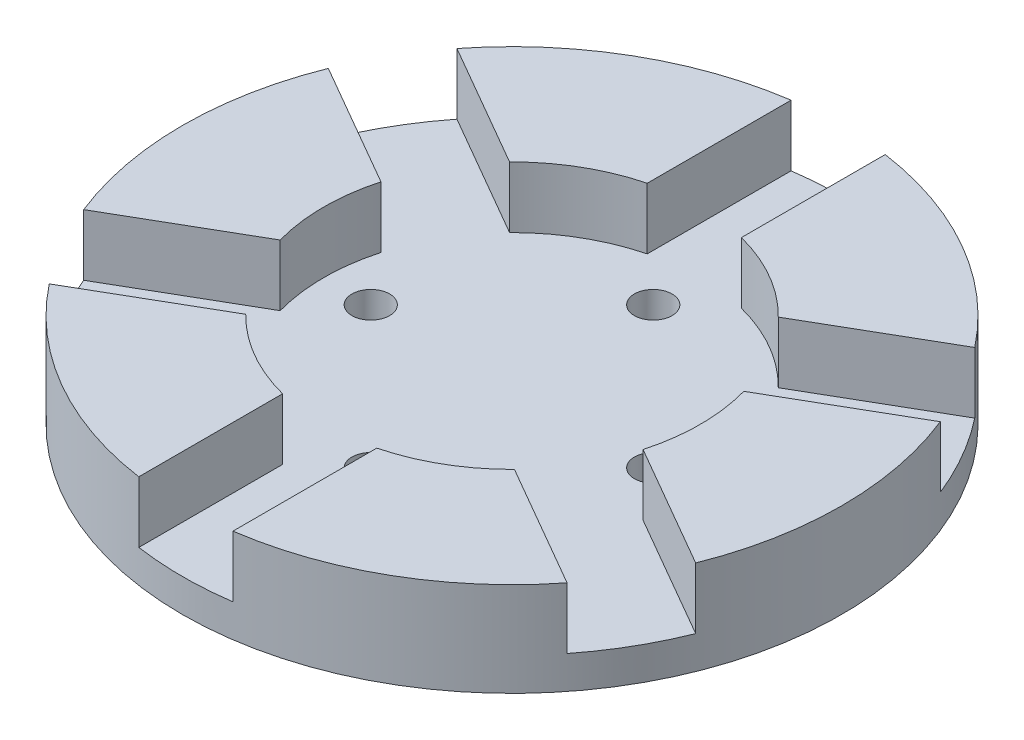
ISO-10303-21;
HEADER;
FILE_DESCRIPTION(('STEP AP214'),'2;1');
FILE_NAME('part.step','',(''),(''),'','','');
FILE_SCHEMA(('AUTOMOTIVE_DESIGN { 1 0 10303 214 1 1 1 1 }'));
ENDSEC;
DATA;
#1=APPLICATION_CONTEXT('core data for automotive mechanical design processes');
#2=APPLICATION_PROTOCOL_DEFINITION('international standard','automotive_design',2000,#1);
#3=PRODUCT_CONTEXT('',#1,'mechanical');
#4=PRODUCT('Part','Part','',(#3));
#5=PRODUCT_RELATED_PRODUCT_CATEGORY('part','',(#4));
#6=PRODUCT_DEFINITION_FORMATION('','',#4);
#7=PRODUCT_DEFINITION_CONTEXT('part definition',#1,'design');
#8=PRODUCT_DEFINITION('design','',#6,#7);
#9=PRODUCT_DEFINITION_SHAPE('','',#8);
#10=(LENGTH_UNIT() NAMED_UNIT(*) SI_UNIT(.MILLI.,.METRE.));
#11=(NAMED_UNIT(*) PLANE_ANGLE_UNIT() SI_UNIT($,.RADIAN.));
#12=(NAMED_UNIT(*) SI_UNIT($,.STERADIAN.) SOLID_ANGLE_UNIT());
#13=UNCERTAINTY_MEASURE_WITH_UNIT(LENGTH_MEASURE(1.E-05),#10,'distance_accuracy_value','');
#14=(GEOMETRIC_REPRESENTATION_CONTEXT(3) GLOBAL_UNCERTAINTY_ASSIGNED_CONTEXT((#13)) GLOBAL_UNIT_ASSIGNED_CONTEXT((#10,
#11,#12)) REPRESENTATION_CONTEXT('',''));
#15=CARTESIAN_POINT('',(0.,0.,0.));
#16=DIRECTION('',(0.,0.,1.));
#17=DIRECTION('',(1.,0.,0.));
#18=AXIS2_PLACEMENT_3D('',#15,#16,#17);
#19=CARTESIAN_POINT('',(0.,10.,0.));
#20=DIRECTION('',(0.,1.,0.));
#21=DIRECTION('',(0.,0.,1.));
#22=AXIS2_PLACEMENT_3D('',#19,#20,#21);
#23=PLANE('',#22);
#24=CARTESIAN_POINT('',(0.,10.,0.));
#25=DIRECTION('',(0.,1.,0.));
#26=DIRECTION('',(0.,0.,1.));
#27=AXIS2_PLACEMENT_3D('',#24,#25,#26);
#28=CIRCLE('',#27,20.);
#29=CARTESIAN_POINT('',(14.2705098312483,10.,-14.0125853844408));
#30=VERTEX_POINT('',#29);
#31=CARTESIAN_POINT('',(5.00000000000001,10.,-19.3649167310371));
#32=VERTEX_POINT('',#31);
#33=EDGE_CURVE('E457',#30,#32,#28,.T.);
#34=ORIENTED_EDGE('',*,*,#33,.F.);
#35=DIRECTION('',(-0.866025403784436,0.,0.500000000000004));
#36=VECTOR('',#35,1.);
#37=CARTESIAN_POINT('',(-2.50000000000002,10.,-4.33012701892219));
#38=LINE('',#37,#36);
#39=CARTESIAN_POINT('',(27.4999999999999,10.,-21.6506350946111));
#40=VERTEX_POINT('',#39);
#41=EDGE_CURVE('E405',#40,#30,#38,.T.);
#42=ORIENTED_EDGE('',*,*,#41,.F.);
#43=CARTESIAN_POINT('',(0.,10.,0.));
#44=DIRECTION('',(0.,1.,0.));
#45=DIRECTION('',(0.,0.,1.));
#46=AXIS2_PLACEMENT_3D('',#43,#44,#45);
#47=CIRCLE('',#46,35.);
#48=CARTESIAN_POINT('',(5.,10.,-34.6410161513776));
#49=VERTEX_POINT('',#48);
#50=EDGE_CURVE('E264',#40,#49,#47,.T.);
#51=ORIENTED_EDGE('',*,*,#50,.T.);
#52=DIRECTION('',(0.,0.,-1.));
#53=VECTOR('',#52,1.);
#54=CARTESIAN_POINT('',(5.,10.,0.));
#55=LINE('',#54,#53);
#56=EDGE_CURVE('E230',#32,#49,#55,.T.);
#57=ORIENTED_EDGE('',*,*,#56,.F.);
#58=EDGE_LOOP('',(#34,#42,#51,#57));
#59=FACE_BOUND('',#58,.T.);
#60=ADVANCED_FACE('F41',(#59),#23,.T.);
#61=CARTESIAN_POINT('',(19.2705098312485,10.,5.35233134659616));
#62=VERTEX_POINT('',#61);
#63=CARTESIAN_POINT('',(19.2705098312484,10.,-5.35233134659643));
#64=VERTEX_POINT('',#63);
#65=EDGE_CURVE('E224',#62,#64,#28,.T.);
#66=ORIENTED_EDGE('',*,*,#65,.F.);
#67=DIRECTION('',(-0.866025403784443,0.,-0.499999999999992));
#68=VECTOR('',#67,1.);
#69=CARTESIAN_POINT('',(2.49999999999996,10.,-4.33012701892221));
#70=LINE('',#69,#68);
#71=CARTESIAN_POINT('',(32.5000000000001,10.,12.9903810567663));
#72=VERTEX_POINT('',#71);
#73=EDGE_CURVE('E263',#72,#62,#70,.T.);
#74=ORIENTED_EDGE('',*,*,#73,.F.);
#75=CARTESIAN_POINT('',(32.4999999999999,10.,-12.9903810567667));
#76=VERTEX_POINT('',#75);
#77=EDGE_CURVE('E246',#72,#76,#47,.T.);
#78=ORIENTED_EDGE('',*,*,#77,.T.);
#79=DIRECTION('',(0.866025403784436,0.,-0.500000000000004));
#80=VECTOR('',#79,1.);
#81=CARTESIAN_POINT('',(2.50000000000002,10.,4.33012701892218));
#82=LINE('',#81,#80);
#83=EDGE_CURVE('E261',#64,#76,#82,.T.);
#84=ORIENTED_EDGE('',*,*,#83,.F.);
#85=EDGE_LOOP('',(#66,#74,#78,#84));
#86=FACE_BOUND('',#85,.T.);
#87=ADVANCED_FACE('F257',(#86),#23,.T.);
#88=CARTESIAN_POINT('',(-14.2705098312484,10.,14.0125853844408));
#89=VERTEX_POINT('',#88);
#90=CARTESIAN_POINT('',(-5.00000000000001,10.,19.3649167310371));
#91=VERTEX_POINT('',#90);
#92=EDGE_CURVE('E223',#89,#91,#28,.T.);
#93=ORIENTED_EDGE('',*,*,#92,.F.);
#94=DIRECTION('',(0.866025403784436,0.,-0.500000000000004));
#95=VECTOR('',#94,1.);
#96=CARTESIAN_POINT('',(2.50000000000002,10.,4.33012701892218));
#97=LINE('',#96,#95);
#98=CARTESIAN_POINT('',(-27.4999999999999,10.,21.6506350946111));
#99=VERTEX_POINT('',#98);
#100=EDGE_CURVE('E437',#99,#89,#97,.T.);
#101=ORIENTED_EDGE('',*,*,#100,.F.);
#102=CARTESIAN_POINT('',(-5.,10.,34.6410161513776));
#103=VERTEX_POINT('',#102);
#104=EDGE_CURVE('E270',#99,#103,#47,.T.);
#105=ORIENTED_EDGE('',*,*,#104,.T.);
#106=DIRECTION('',(0.,0.,1.));
#107=VECTOR('',#106,1.);
#108=CARTESIAN_POINT('',(-5.,10.,0.));
#109=LINE('',#108,#107);
#110=EDGE_CURVE('E268',#91,#103,#109,.T.);
#111=ORIENTED_EDGE('',*,*,#110,.F.);
#112=EDGE_LOOP('',(#93,#101,#105,#111));
#113=FACE_BOUND('',#112,.T.);
#114=ADVANCED_FACE('F359',(#113),#23,.T.);
#115=CARTESIAN_POINT('',(-19.2705098312485,10.,-5.35233134659616));
#116=VERTEX_POINT('',#115);
#117=CARTESIAN_POINT('',(-19.2705098312484,10.,5.35233134659644));
#118=VERTEX_POINT('',#117);
#119=EDGE_CURVE('E57',#116,#118,#28,.T.);
#120=ORIENTED_EDGE('',*,*,#119,.F.);
#121=DIRECTION('',(0.866025403784443,0.,0.499999999999992));
#122=VECTOR('',#121,1.);
#123=CARTESIAN_POINT('',(-2.49999999999996,10.,4.33012701892222));
#124=LINE('',#123,#122);
#125=CARTESIAN_POINT('',(-32.5000000000001,10.,-12.9903810567663));
#126=VERTEX_POINT('',#125);
#127=EDGE_CURVE('E228',#126,#116,#124,.T.);
#128=ORIENTED_EDGE('',*,*,#127,.F.);
#129=CARTESIAN_POINT('',(-32.5,10.,12.9903810567667));
#130=VERTEX_POINT('',#129);
#131=EDGE_CURVE('E269',#126,#130,#47,.T.);
#132=ORIENTED_EDGE('',*,*,#131,.T.);
#133=DIRECTION('',(-0.866025403784436,0.,0.500000000000004));
#134=VECTOR('',#133,1.);
#135=CARTESIAN_POINT('',(-2.50000000000002,10.,-4.33012701892219));
#136=LINE('',#135,#134);
#137=EDGE_CURVE('E233',#118,#130,#136,.T.);
#138=ORIENTED_EDGE('',*,*,#137,.F.);
#139=EDGE_LOOP('',(#120,#128,#132,#138));
#140=FACE_BOUND('',#139,.T.);
#141=ADVANCED_FACE('F366',(#140),#23,.T.);
#142=CARTESIAN_POINT('',(5.,20.1011973701649,-35.));
#143=DIRECTION('',(1.,0.,0.));
#144=DIRECTION('',(0.,1.,0.));
#145=AXIS2_PLACEMENT_3D('',#142,#143,#144);
#146=PLANE('',#145);
#147=DIRECTION('',(0.,0.,1.));
#148=VECTOR('',#147,1.);
#149=CARTESIAN_POINT('',(5.,3.5,-35.));
#150=LINE('',#149,#148);
#151=CARTESIAN_POINT('',(5.,3.5,-34.6410161513776));
#152=VERTEX_POINT('',#151);
#153=CARTESIAN_POINT('',(5.,3.5,-19.3649167310371));
#154=VERTEX_POINT('',#153);
#155=EDGE_CURVE('E286',#152,#154,#150,.T.);
#156=ORIENTED_EDGE('',*,*,#155,.T.);
#157=DIRECTION('',(0.,1.,0.));
#158=VECTOR('',#157,1.);
#159=CARTESIAN_POINT('',(5.00000000000001,-53.0685424949238,-19.3649167310371));
#160=LINE('',#159,#158);
#161=EDGE_CURVE('E494',#154,#32,#160,.T.);
#162=ORIENTED_EDGE('',*,*,#161,.T.);
#163=ORIENTED_EDGE('',*,*,#56,.T.);
#164=DIRECTION('',(0.,-1.,0.));
#165=VECTOR('',#164,1.);
#166=CARTESIAN_POINT('',(5.,10.,-34.6410161513776));
#167=LINE('',#166,#165);
#168=EDGE_CURVE('E318',#152,#49,#167,.F.);
#169=ORIENTED_EDGE('',*,*,#168,.F.);
#170=EDGE_LOOP('',(#156,#162,#163,#169));
#171=FACE_BOUND('',#170,.T.);
#172=ADVANCED_FACE('F375',(#171),#146,.F.);
#173=CARTESIAN_POINT('',(-5.,20.1011973701649,-35.));
#174=DIRECTION('',(-1.,0.,0.));
#175=DIRECTION('',(0.,-1.,0.));
#176=AXIS2_PLACEMENT_3D('',#173,#174,#175);
#177=PLANE('',#176);
#178=DIRECTION('',(0.,0.,1.));
#179=VECTOR('',#178,1.);
#180=CARTESIAN_POINT('',(-5.,3.5,-35.));
#181=LINE('',#180,#179);
#182=CARTESIAN_POINT('',(-5.,3.5,19.3649167310371));
#183=VERTEX_POINT('',#182);
#184=CARTESIAN_POINT('',(-5.,3.5,34.6410161513776));
#185=VERTEX_POINT('',#184);
#186=EDGE_CURVE('E306',#183,#185,#181,.T.);
#187=ORIENTED_EDGE('',*,*,#186,.F.);
#188=DIRECTION('',(0.,1.,0.));
#189=VECTOR('',#188,1.);
#190=CARTESIAN_POINT('',(-5.00000000000001,-53.0685424949238,19.3649167310371));
#191=LINE('',#190,#189);
#192=EDGE_CURVE('E211',#183,#91,#191,.T.);
#193=ORIENTED_EDGE('',*,*,#192,.T.);
#194=ORIENTED_EDGE('',*,*,#110,.T.);
#195=DIRECTION('',(0.,-1.,0.));
#196=VECTOR('',#195,1.);
#197=CARTESIAN_POINT('',(-5.,10.,34.6410161513776));
#198=LINE('',#197,#196);
#199=EDGE_CURVE('E311',#185,#103,#198,.F.);
#200=ORIENTED_EDGE('',*,*,#199,.F.);
#201=EDGE_LOOP('',(#187,#193,#194,#200));
#202=FACE_BOUND('',#201,.T.);
#203=ADVANCED_FACE('F370',(#202),#177,.F.);
#204=CARTESIAN_POINT('',(5.00000000000001,10.,19.3649167310371));
#205=VERTEX_POINT('',#204);
#206=CARTESIAN_POINT('',(14.2705098312485,10.,14.0125853844406));
#207=VERTEX_POINT('',#206);
#208=EDGE_CURVE('E204',#205,#207,#28,.T.);
#209=ORIENTED_EDGE('',*,*,#208,.F.);
#210=CARTESIAN_POINT('',(5.,10.,34.6410161513776));
#211=VERTEX_POINT('',#210);
#212=EDGE_CURVE('E218',#211,#205,#55,.T.);
#213=ORIENTED_EDGE('',*,*,#212,.F.);
#214=CARTESIAN_POINT('',(27.5000000000002,10.,21.6506350946107));
#215=VERTEX_POINT('',#214);
#216=EDGE_CURVE('E262',#211,#215,#47,.T.);
#217=ORIENTED_EDGE('',*,*,#216,.T.);
#218=DIRECTION('',(0.866025403784443,0.,0.499999999999992));
#219=VECTOR('',#218,1.);
#220=CARTESIAN_POINT('',(-2.49999999999996,10.,4.33012701892222));
#221=LINE('',#220,#219);
#222=EDGE_CURVE('E222',#207,#215,#221,.T.);
#223=ORIENTED_EDGE('',*,*,#222,.F.);
#224=EDGE_LOOP('',(#209,#213,#217,#223));
#225=FACE_BOUND('',#224,.T.);
#226=ADVANCED_FACE('F220',(#225),#23,.T.);
#227=CARTESIAN_POINT('',(0.,10.,0.));
#228=DIRECTION('',(0.,-1.,0.));
#229=DIRECTION('',(0.,0.,-1.));
#230=AXIS2_PLACEMENT_3D('',#227,#228,#229);
#231=CYLINDRICAL_SURFACE('',#230,35.);
#232=CARTESIAN_POINT('',(0.,3.5,0.));
#233=DIRECTION('',(0.,-1.,0.));
#234=DIRECTION('',(0.,0.,-1.));
#235=AXIS2_PLACEMENT_3D('',#232,#233,#234);
#236=CIRCLE('',#235,35.);
#237=CARTESIAN_POINT('',(-27.4999999999999,3.5,21.6506350946111));
#238=VERTEX_POINT('',#237);
#239=CARTESIAN_POINT('',(-32.4999999999999,3.5,12.9903810567667));
#240=VERTEX_POINT('',#239);
#241=EDGE_CURVE('E435',#238,#240,#236,.T.);
#242=ORIENTED_EDGE('',*,*,#241,.T.);
#243=DIRECTION('',(0.,-1.,0.));
#244=VECTOR('',#243,1.);
#245=CARTESIAN_POINT('',(-32.4999999999999,10.,12.9903810567667));
#246=LINE('',#245,#244);
#247=EDGE_CURVE('E400',#240,#130,#246,.F.);
#248=ORIENTED_EDGE('',*,*,#247,.T.);
#249=ORIENTED_EDGE('',*,*,#131,.F.);
#250=DIRECTION('',(0.,-1.,0.));
#251=VECTOR('',#250,1.);
#252=CARTESIAN_POINT('',(-32.5000000000001,10.,-12.9903810567663));
#253=LINE('',#252,#251);
#254=CARTESIAN_POINT('',(-32.5000000000001,3.5,-12.9903810567663));
#255=VERTEX_POINT('',#254);
#256=EDGE_CURVE('E394',#126,#255,#253,.T.);
#257=ORIENTED_EDGE('',*,*,#256,.T.);
#258=CARTESIAN_POINT('',(-27.5000000000002,3.5,-21.6506350946107));
#259=VERTEX_POINT('',#258);
#260=EDGE_CURVE('E430',#255,#259,#236,.T.);
#261=ORIENTED_EDGE('',*,*,#260,.T.);
#262=DIRECTION('',(0.,-1.,0.));
#263=VECTOR('',#262,1.);
#264=CARTESIAN_POINT('',(-27.5000000000002,10.,-21.6506350946107));
#265=LINE('',#264,#263);
#266=CARTESIAN_POINT('',(-27.5000000000002,10.,-21.6506350946107));
#267=VERTEX_POINT('',#266);
#268=EDGE_CURVE('E426',#259,#267,#265,.F.);
#269=ORIENTED_EDGE('',*,*,#268,.T.);
#270=CARTESIAN_POINT('',(-5.,10.,-34.6410161513776));
#271=VERTEX_POINT('',#270);
#272=EDGE_CURVE('E267',#271,#267,#47,.T.);
#273=ORIENTED_EDGE('',*,*,#272,.F.);
#274=DIRECTION('',(0.,-1.,0.));
#275=VECTOR('',#274,1.);
#276=CARTESIAN_POINT('',(-5.,10.,-34.6410161513776));
#277=LINE('',#276,#275);
#278=CARTESIAN_POINT('',(-5.,3.5,-34.6410161513776));
#279=VERTEX_POINT('',#278);
#280=EDGE_CURVE('E312',#271,#279,#277,.T.);
#281=ORIENTED_EDGE('',*,*,#280,.T.);
#282=CARTESIAN_POINT('',(0.,3.5,0.));
#283=DIRECTION('',(0.,-1.,0.));
#284=DIRECTION('',(1.,0.,0.));
#285=AXIS2_PLACEMENT_3D('',#282,#283,#284);
#286=CIRCLE('',#285,35.);
#287=EDGE_CURVE('E294',#279,#152,#286,.T.);
#288=ORIENTED_EDGE('',*,*,#287,.T.);
#289=ORIENTED_EDGE('',*,*,#168,.T.);
#290=ORIENTED_EDGE('',*,*,#50,.F.);
#291=DIRECTION('',(0.,-1.,0.));
#292=VECTOR('',#291,1.);
#293=CARTESIAN_POINT('',(27.4999999999999,10.,-21.6506350946111));
#294=LINE('',#293,#292);
#295=CARTESIAN_POINT('',(27.4999999999999,3.5,-21.6506350946111));
#296=VERTEX_POINT('',#295);
#297=EDGE_CURVE('E398',#40,#296,#294,.T.);
#298=ORIENTED_EDGE('',*,*,#297,.T.);
#299=CARTESIAN_POINT('',(32.4999999999999,3.5,-12.9903810567667));
#300=VERTEX_POINT('',#299);
#301=EDGE_CURVE('E251',#296,#300,#236,.T.);
#302=ORIENTED_EDGE('',*,*,#301,.T.);
#303=DIRECTION('',(0.,-1.,0.));
#304=VECTOR('',#303,1.);
#305=CARTESIAN_POINT('',(32.4999999999999,10.,-12.9903810567667));
#306=LINE('',#305,#304);
#307=EDGE_CURVE('E47',#300,#76,#306,.F.);
#308=ORIENTED_EDGE('',*,*,#307,.T.);
#309=ORIENTED_EDGE('',*,*,#77,.F.);
#310=DIRECTION('',(0.,-1.,0.));
#311=VECTOR('',#310,1.);
#312=CARTESIAN_POINT('',(32.5000000000001,10.,12.9903810567663));
#313=LINE('',#312,#311);
#314=CARTESIAN_POINT('',(32.5000000000001,3.5,12.9903810567663));
#315=VERTEX_POINT('',#314);
#316=EDGE_CURVE('E238',#72,#315,#313,.T.);
#317=ORIENTED_EDGE('',*,*,#316,.T.);
#318=CARTESIAN_POINT('',(27.5000000000002,3.5,21.6506350946107));
#319=VERTEX_POINT('',#318);
#320=EDGE_CURVE('E509',#315,#319,#236,.T.);
#321=ORIENTED_EDGE('',*,*,#320,.T.);
#322=DIRECTION('',(0.,-1.,0.));
#323=VECTOR('',#322,1.);
#324=CARTESIAN_POINT('',(27.5000000000002,10.,21.6506350946107));
#325=LINE('',#324,#323);
#326=EDGE_CURVE('E443',#319,#215,#325,.F.);
#327=ORIENTED_EDGE('',*,*,#326,.T.);
#328=ORIENTED_EDGE('',*,*,#216,.F.);
#329=DIRECTION('',(0.,-1.,0.));
#330=VECTOR('',#329,1.);
#331=CARTESIAN_POINT('',(5.,10.,34.6410161513776));
#332=LINE('',#331,#330);
#333=CARTESIAN_POINT('',(5.,3.5,34.6410161513776));
#334=VERTEX_POINT('',#333);
#335=EDGE_CURVE('E229',#211,#334,#332,.T.);
#336=ORIENTED_EDGE('',*,*,#335,.T.);
#337=EDGE_CURVE('E309',#334,#185,#286,.T.);
#338=ORIENTED_EDGE('',*,*,#337,.T.);
#339=ORIENTED_EDGE('',*,*,#199,.T.);
#340=ORIENTED_EDGE('',*,*,#104,.F.);
#341=DIRECTION('',(0.,-1.,0.));
#342=VECTOR('',#341,1.);
#343=CARTESIAN_POINT('',(-27.4999999999999,10.,21.6506350946111));
#344=LINE('',#343,#342);
#345=EDGE_CURVE('E442',#99,#238,#344,.T.);
#346=ORIENTED_EDGE('',*,*,#345,.T.);
#347=EDGE_LOOP('',(#242,#248,#249,#257,#261,#269,#273,#281,#288,#289,#290,#298,#302,#308,#309,
#317,#321,#327,#328,#336,#338,#339,#340,#346));
#348=FACE_BOUND('',#347,.T.);
#349=CARTESIAN_POINT('',(0.,0.,0.));
#350=DIRECTION('',(0.,1.,0.));
#351=DIRECTION('',(0.,0.,1.));
#352=AXIS2_PLACEMENT_3D('',#349,#350,#351);
#353=CIRCLE('',#352,35.);
#354=CARTESIAN_POINT('',(0.,0.,35.));
#355=VERTEX_POINT('',#354);
#356=EDGE_CURVE('E274',#355,#355,#353,.T.);
#357=ORIENTED_EDGE('',*,*,#356,.T.);
#358=EDGE_LOOP('',(#357));
#359=FACE_BOUND('',#358,.T.);
#360=ADVANCED_FACE('F43',(#348,#359),#231,.T.);
#361=CARTESIAN_POINT('',(-5.00000000000001,10.,-19.3649167310371));
#362=VERTEX_POINT('',#361);
#363=CARTESIAN_POINT('',(-14.2705098312486,10.,-14.0125853844406));
#364=VERTEX_POINT('',#363);
#365=EDGE_CURVE('E387',#362,#364,#28,.T.);
#366=ORIENTED_EDGE('',*,*,#365,.F.);
#367=EDGE_CURVE('E231',#271,#362,#109,.T.);
#368=ORIENTED_EDGE('',*,*,#367,.F.);
#369=ORIENTED_EDGE('',*,*,#272,.T.);
#370=DIRECTION('',(-0.866025403784443,0.,-0.499999999999992));
#371=VECTOR('',#370,1.);
#372=CARTESIAN_POINT('',(2.49999999999996,10.,-4.33012701892221));
#373=LINE('',#372,#371);
#374=EDGE_CURVE('E429',#364,#267,#373,.T.);
#375=ORIENTED_EDGE('',*,*,#374,.F.);
#376=EDGE_LOOP('',(#366,#368,#369,#375));
#377=FACE_BOUND('',#376,.T.);
#378=ADVANCED_FACE('F337',(#377),#23,.T.);
#379=CARTESIAN_POINT('',(0.,0.,0.));
#380=DIRECTION('',(0.,1.,0.));
#381=DIRECTION('',(0.,0.,1.));
#382=AXIS2_PLACEMENT_3D('',#379,#380,#381);
#383=PLANE('',#382);
#384=CARTESIAN_POINT('',(-15.,0.,0.));
#385=DIRECTION('',(0.,1.,0.));
#386=DIRECTION('',(0.,0.,1.));
#387=AXIS2_PLACEMENT_3D('',#384,#385,#386);
#388=CIRCLE('',#387,2.);
#389=CARTESIAN_POINT('',(-15.,0.,2.00000000000005));
#390=VERTEX_POINT('',#389);
#391=EDGE_CURVE('E287',#390,#390,#388,.F.);
#392=ORIENTED_EDGE('',*,*,#391,.F.);
#393=EDGE_LOOP('',(#392));
#394=FACE_BOUND('',#393,.T.);
#395=CARTESIAN_POINT('',(0.,0.,15.));
#396=DIRECTION('',(0.,1.,0.));
#397=DIRECTION('',(0.,0.,1.));
#398=AXIS2_PLACEMENT_3D('',#395,#396,#397);
#399=CIRCLE('',#398,2.);
#400=CARTESIAN_POINT('',(0.,0.,17.));
#401=VERTEX_POINT('',#400);
#402=EDGE_CURVE('E324',#401,#401,#399,.F.);
#403=ORIENTED_EDGE('',*,*,#402,.F.);
#404=EDGE_LOOP('',(#403));
#405=FACE_BOUND('',#404,.T.);
#406=CARTESIAN_POINT('',(15.,0.,-1.57116660247941E-13));
#407=DIRECTION('',(0.,1.,0.));
#408=DIRECTION('',(0.,0.,1.));
#409=AXIS2_PLACEMENT_3D('',#406,#407,#408);
#410=CIRCLE('',#409,2.);
#411=CARTESIAN_POINT('',(15.,0.,1.99999999999984));
#412=VERTEX_POINT('',#411);
#413=EDGE_CURVE('E325',#412,#412,#410,.F.);
#414=ORIENTED_EDGE('',*,*,#413,.F.);
#415=EDGE_LOOP('',(#414));
#416=FACE_BOUND('',#415,.T.);
#417=CARTESIAN_POINT('',(0.,0.,-15.));
#418=DIRECTION('',(0.,1.,0.));
#419=DIRECTION('',(0.,0.,1.));
#420=AXIS2_PLACEMENT_3D('',#417,#418,#419);
#421=CIRCLE('',#420,2.);
#422=CARTESIAN_POINT('',(0.,0.,-13.));
#423=VERTEX_POINT('',#422);
#424=EDGE_CURVE('E284',#423,#423,#421,.F.);
#425=ORIENTED_EDGE('',*,*,#424,.F.);
#426=EDGE_LOOP('',(#425));
#427=FACE_BOUND('',#426,.T.);
#428=ORIENTED_EDGE('',*,*,#356,.F.);
#429=EDGE_LOOP('',(#428));
#430=FACE_BOUND('',#429,.T.);
#431=ADVANCED_FACE('F334',(#394,#405,#416,#427,#430),#383,.F.);
#432=CARTESIAN_POINT('',(0.,-0.000999999999999265,-15.));
#433=DIRECTION('',(0.,1.,0.));
#434=DIRECTION('',(0.,0.,1.));
#435=AXIS2_PLACEMENT_3D('',#432,#433,#434);
#436=CYLINDRICAL_SURFACE('',#435,2.);
#437=CARTESIAN_POINT('',(0.,3.5,-15.));
#438=DIRECTION('',(0.,-1.,0.));
#439=DIRECTION('',(1.,0.,0.));
#440=AXIS2_PLACEMENT_3D('',#437,#438,#439);
#441=CIRCLE('',#440,2.);
#442=CARTESIAN_POINT('',(2.,3.5,-15.));
#443=VERTEX_POINT('',#442);
#444=EDGE_CURVE('E289',#443,#443,#441,.F.);
#445=ORIENTED_EDGE('',*,*,#444,.T.);
#446=EDGE_LOOP('',(#445));
#447=FACE_BOUND('',#446,.T.);
#448=ORIENTED_EDGE('',*,*,#424,.T.);
#449=EDGE_LOOP('',(#448));
#450=FACE_BOUND('',#449,.T.);
#451=ADVANCED_FACE('F336',(#447,#450),#436,.F.);
#452=CARTESIAN_POINT('',(15.,-0.000999999999999265,-1.57116660247941E-13));
#453=DIRECTION('',(0.,1.,0.));
#454=DIRECTION('',(0.,0.,1.));
#455=AXIS2_PLACEMENT_3D('',#452,#453,#454);
#456=CYLINDRICAL_SURFACE('',#455,2.);
#457=CARTESIAN_POINT('',(15.,3.5,-1.57116660247941E-13));
#458=DIRECTION('',(0.,-1.,0.));
#459=DIRECTION('',(1.,0.,0.));
#460=AXIS2_PLACEMENT_3D('',#457,#458,#459);
#461=CIRCLE('',#460,2.);
#462=CARTESIAN_POINT('',(17.,3.5,-1.57116660247941E-13));
#463=VERTEX_POINT('',#462);
#464=EDGE_CURVE('E488',#463,#463,#461,.F.);
#465=ORIENTED_EDGE('',*,*,#464,.T.);
#466=EDGE_LOOP('',(#465));
#467=FACE_BOUND('',#466,.T.);
#468=ORIENTED_EDGE('',*,*,#413,.T.);
#469=EDGE_LOOP('',(#468));
#470=FACE_BOUND('',#469,.T.);
#471=ADVANCED_FACE('F332',(#467,#470),#456,.F.);
#472=CARTESIAN_POINT('',(0.,-0.000999999999999265,15.));
#473=DIRECTION('',(0.,1.,0.));
#474=DIRECTION('',(0.,0.,1.));
#475=AXIS2_PLACEMENT_3D('',#472,#473,#474);
#476=CYLINDRICAL_SURFACE('',#475,2.);
#477=CARTESIAN_POINT('',(0.,3.5,15.));
#478=DIRECTION('',(0.,-1.,0.));
#479=DIRECTION('',(1.,0.,0.));
#480=AXIS2_PLACEMENT_3D('',#477,#478,#479);
#481=CIRCLE('',#480,2.);
#482=CARTESIAN_POINT('',(2.,3.5,15.));
#483=VERTEX_POINT('',#482);
#484=EDGE_CURVE('E290',#483,#483,#481,.F.);
#485=ORIENTED_EDGE('',*,*,#484,.T.);
#486=EDGE_LOOP('',(#485));
#487=FACE_BOUND('',#486,.T.);
#488=ORIENTED_EDGE('',*,*,#402,.T.);
#489=EDGE_LOOP('',(#488));
#490=FACE_BOUND('',#489,.T.);
#491=ADVANCED_FACE('F349',(#487,#490),#476,.F.);
#492=CARTESIAN_POINT('',(-15.,-0.000999999999999265,0.));
#493=DIRECTION('',(0.,1.,0.));
#494=DIRECTION('',(0.,0.,1.));
#495=AXIS2_PLACEMENT_3D('',#492,#493,#494);
#496=CYLINDRICAL_SURFACE('',#495,2.);
#497=CARTESIAN_POINT('',(-15.,3.5,0.));
#498=DIRECTION('',(0.,-1.,0.));
#499=DIRECTION('',(1.,0.,0.));
#500=AXIS2_PLACEMENT_3D('',#497,#498,#499);
#501=CIRCLE('',#500,2.);
#502=CARTESIAN_POINT('',(-13.,3.5,0.));
#503=VERTEX_POINT('',#502);
#504=EDGE_CURVE('E495',#503,#503,#501,.F.);
#505=ORIENTED_EDGE('',*,*,#504,.T.);
#506=EDGE_LOOP('',(#505));
#507=FACE_BOUND('',#506,.T.);
#508=ORIENTED_EDGE('',*,*,#391,.T.);
#509=EDGE_LOOP('',(#508));
#510=FACE_BOUND('',#509,.T.);
#511=ADVANCED_FACE('F682',(#507,#510),#496,.F.);
#512=ORIENTED_EDGE('',*,*,#212,.T.);
#513=DIRECTION('',(0.,1.,0.));
#514=VECTOR('',#513,1.);
#515=CARTESIAN_POINT('',(5.00000000000001,-53.0685424949238,19.3649167310371));
#516=LINE('',#515,#514);
#517=CARTESIAN_POINT('',(5.,3.5,19.3649167310371));
#518=VERTEX_POINT('',#517);
#519=EDGE_CURVE('E203',#205,#518,#516,.F.);
#520=ORIENTED_EDGE('',*,*,#519,.T.);
#521=EDGE_CURVE('E297',#518,#334,#150,.T.);
#522=ORIENTED_EDGE('',*,*,#521,.T.);
#523=ORIENTED_EDGE('',*,*,#335,.F.);
#524=EDGE_LOOP('',(#512,#520,#522,#523));
#525=FACE_BOUND('',#524,.T.);
#526=ADVANCED_FACE('F226',(#525),#146,.F.);
#527=ORIENTED_EDGE('',*,*,#367,.T.);
#528=DIRECTION('',(0.,1.,0.));
#529=VECTOR('',#528,1.);
#530=CARTESIAN_POINT('',(-5.00000000000001,-53.0685424949238,-19.3649167310371));
#531=LINE('',#530,#529);
#532=CARTESIAN_POINT('',(-5.,3.5,-19.3649167310371));
#533=VERTEX_POINT('',#532);
#534=EDGE_CURVE('E215',#362,#533,#531,.F.);
#535=ORIENTED_EDGE('',*,*,#534,.T.);
#536=EDGE_CURVE('E303',#279,#533,#181,.T.);
#537=ORIENTED_EDGE('',*,*,#536,.F.);
#538=ORIENTED_EDGE('',*,*,#280,.F.);
#539=EDGE_LOOP('',(#527,#535,#537,#538));
#540=FACE_BOUND('',#539,.T.);
#541=ADVANCED_FACE('F374',(#540),#177,.F.);
#542=CARTESIAN_POINT('',(-5.,3.5,-35.));
#543=DIRECTION('',(0.,-1.,0.));
#544=DIRECTION('',(1.,0.,0.));
#545=AXIS2_PLACEMENT_3D('',#542,#543,#544);
#546=PLANE('',#545);
#547=DIRECTION('',(-0.866025403784443,0.,-0.499999999999992));
#548=VECTOR('',#547,1.);
#549=CARTESIAN_POINT('',(38.9054445662278,3.5,28.2355715851495));
#550=LINE('',#549,#548);
#551=CARTESIAN_POINT('',(-19.2705098312485,3.5,-5.35233134659616));
#552=VERTEX_POINT('',#551);
#553=EDGE_CURVE('E393',#552,#255,#550,.T.);
#554=ORIENTED_EDGE('',*,*,#553,.F.);
#555=CARTESIAN_POINT('',(0.,3.5,0.));
#556=DIRECTION('',(0.,-1.,0.));
#557=DIRECTION('',(1.,0.,0.));
#558=AXIS2_PLACEMENT_3D('',#555,#556,#557);
#559=CIRCLE('',#558,20.);
#560=CARTESIAN_POINT('',(-19.2705098312484,3.5,5.35233134659643));
#561=VERTEX_POINT('',#560);
#562=EDGE_CURVE('E470',#552,#561,#559,.F.);
#563=ORIENTED_EDGE('',*,*,#562,.T.);
#564=DIRECTION('',(0.866025403784436,0.,-0.500000000000004));
#565=VECTOR('',#564,1.);
#566=CARTESIAN_POINT('',(-43.9054445662276,3.5,19.5753175473057));
#567=LINE('',#566,#565);
#568=EDGE_CURVE('E432',#240,#561,#567,.T.);
#569=ORIENTED_EDGE('',*,*,#568,.F.);
#570=ORIENTED_EDGE('',*,*,#241,.F.);
#571=DIRECTION('',(0.866025403784436,0.,-0.500000000000004));
#572=VECTOR('',#571,1.);
#573=CARTESIAN_POINT('',(-38.9054445662276,3.5,28.2355715851501));
#574=LINE('',#573,#572);
#575=CARTESIAN_POINT('',(-14.2705098312484,3.5,14.0125853844408));
#576=VERTEX_POINT('',#575);
#577=EDGE_CURVE('E479',#238,#576,#574,.T.);
#578=ORIENTED_EDGE('',*,*,#577,.T.);
#579=EDGE_CURVE('E63',#576,#183,#559,.F.);
#580=ORIENTED_EDGE('',*,*,#579,.T.);
#581=ORIENTED_EDGE('',*,*,#186,.T.);
#582=ORIENTED_EDGE('',*,*,#337,.F.);
#583=ORIENTED_EDGE('',*,*,#521,.F.);
#584=CARTESIAN_POINT('',(14.2705098312485,3.5,14.0125853844406));
#585=VERTEX_POINT('',#584);
#586=EDGE_CURVE('E210',#518,#585,#559,.F.);
#587=ORIENTED_EDGE('',*,*,#586,.T.);
#588=EDGE_CURVE('E484',#319,#585,#550,.T.);
#589=ORIENTED_EDGE('',*,*,#588,.F.);
#590=ORIENTED_EDGE('',*,*,#320,.F.);
#591=DIRECTION('',(-0.866025403784443,0.,-0.499999999999992));
#592=VECTOR('',#591,1.);
#593=CARTESIAN_POINT('',(43.9054445662278,3.5,19.575317547305));
#594=LINE('',#593,#592);
#595=CARTESIAN_POINT('',(19.2705098312485,3.5,5.35233134659617));
#596=VERTEX_POINT('',#595);
#597=EDGE_CURVE('E481',#315,#596,#594,.T.);
#598=ORIENTED_EDGE('',*,*,#597,.T.);
#599=CARTESIAN_POINT('',(19.2705098312484,3.50000000000001,-5.35233134659643));
#600=VERTEX_POINT('',#599);
#601=EDGE_CURVE('E225',#596,#600,#559,.F.);
#602=ORIENTED_EDGE('',*,*,#601,.T.);
#603=EDGE_CURVE('E483',#600,#300,#574,.T.);
#604=ORIENTED_EDGE('',*,*,#603,.T.);
#605=ORIENTED_EDGE('',*,*,#301,.F.);
#606=CARTESIAN_POINT('',(14.2705098312483,3.5,-14.0125853844408));
#607=VERTEX_POINT('',#606);
#608=EDGE_CURVE('E459',#607,#296,#567,.T.);
#609=ORIENTED_EDGE('',*,*,#608,.F.);
#610=EDGE_CURVE('E456',#607,#154,#559,.F.);
#611=ORIENTED_EDGE('',*,*,#610,.T.);
#612=ORIENTED_EDGE('',*,*,#155,.F.);
#613=ORIENTED_EDGE('',*,*,#287,.F.);
#614=ORIENTED_EDGE('',*,*,#536,.T.);
#615=CARTESIAN_POINT('',(-14.2705098312485,3.5,-14.0125853844406));
#616=VERTEX_POINT('',#615);
#617=EDGE_CURVE('E462',#533,#616,#559,.F.);
#618=ORIENTED_EDGE('',*,*,#617,.T.);
#619=EDGE_CURVE('E491',#616,#259,#594,.T.);
#620=ORIENTED_EDGE('',*,*,#619,.T.);
#621=ORIENTED_EDGE('',*,*,#260,.F.);
#622=EDGE_LOOP('',(#554,#563,#569,#570,#578,#580,#581,#582,#583,#587,#589,#590,#598,#602,#604,
#605,#609,#611,#612,#613,#614,#618,#620,#621));
#623=FACE_BOUND('',#622,.T.);
#624=ORIENTED_EDGE('',*,*,#484,.F.);
#625=EDGE_LOOP('',(#624));
#626=FACE_BOUND('',#625,.T.);
#627=ORIENTED_EDGE('',*,*,#444,.F.);
#628=EDGE_LOOP('',(#627));
#629=FACE_BOUND('',#628,.T.);
#630=ORIENTED_EDGE('',*,*,#464,.F.);
#631=EDGE_LOOP('',(#630));
#632=FACE_BOUND('',#631,.T.);
#633=ORIENTED_EDGE('',*,*,#504,.F.);
#634=EDGE_LOOP('',(#633));
#635=FACE_BOUND('',#634,.T.);
#636=ADVANCED_FACE('F410',(#623,#626,#629,#632,#635),#546,.F.);
#637=CARTESIAN_POINT('',(38.9054445662278,20.1011973701649,28.2355715851495));
#638=DIRECTION('',(-0.499999999999992,0.,0.866025403784443));
#639=DIRECTION('',(0.866025403784443,0.,0.499999999999992));
#640=AXIS2_PLACEMENT_3D('',#637,#638,#639);
#641=PLANE('',#640);
#642=ORIENTED_EDGE('',*,*,#127,.T.);
#643=DIRECTION('',(0.,1.,0.));
#644=VECTOR('',#643,1.);
#645=CARTESIAN_POINT('',(-19.2705098312485,-53.0685424949238,-5.35233134659616));
#646=LINE('',#645,#644);
#647=EDGE_CURVE('E388',#116,#552,#646,.F.);
#648=ORIENTED_EDGE('',*,*,#647,.T.);
#649=ORIENTED_EDGE('',*,*,#553,.T.);
#650=ORIENTED_EDGE('',*,*,#256,.F.);
#651=EDGE_LOOP('',(#642,#648,#649,#650));
#652=FACE_BOUND('',#651,.T.);
#653=ADVANCED_FACE('F386',(#652),#641,.F.);
#654=CARTESIAN_POINT('',(-43.9054445662276,20.1011973701649,19.5753175473057));
#655=DIRECTION('',(-0.500000000000004,0.,-0.866025403784436));
#656=DIRECTION('',(-0.866025403784436,0.,0.500000000000004));
#657=AXIS2_PLACEMENT_3D('',#654,#655,#656);
#658=PLANE('',#657);
#659=ORIENTED_EDGE('',*,*,#568,.T.);
#660=DIRECTION('',(0.,1.,0.));
#661=VECTOR('',#660,1.);
#662=CARTESIAN_POINT('',(-19.2705098312484,-53.0685424949238,5.35233134659643));
#663=LINE('',#662,#661);
#664=EDGE_CURVE('E480',#561,#118,#663,.T.);
#665=ORIENTED_EDGE('',*,*,#664,.T.);
#666=ORIENTED_EDGE('',*,*,#137,.T.);
#667=ORIENTED_EDGE('',*,*,#247,.F.);
#668=EDGE_LOOP('',(#659,#665,#666,#667));
#669=FACE_BOUND('',#668,.T.);
#670=ADVANCED_FACE('F478',(#669),#658,.F.);
#671=CARTESIAN_POINT('',(-38.9054445662276,20.1011973701649,28.2355715851501));
#672=DIRECTION('',(0.500000000000004,0.,0.866025403784436));
#673=DIRECTION('',(0.866025403784436,0.,-0.500000000000004));
#674=AXIS2_PLACEMENT_3D('',#671,#672,#673);
#675=PLANE('',#674);
#676=ORIENTED_EDGE('',*,*,#100,.T.);
#677=DIRECTION('',(0.,1.,0.));
#678=VECTOR('',#677,1.);
#679=CARTESIAN_POINT('',(-14.2705098312484,-53.0685424949238,14.0125853844408));
#680=LINE('',#679,#678);
#681=EDGE_CURVE('E501',#89,#576,#680,.F.);
#682=ORIENTED_EDGE('',*,*,#681,.T.);
#683=ORIENTED_EDGE('',*,*,#577,.F.);
#684=ORIENTED_EDGE('',*,*,#345,.F.);
#685=EDGE_LOOP('',(#676,#682,#683,#684));
#686=FACE_BOUND('',#685,.T.);
#687=ADVANCED_FACE('F515',(#686),#675,.F.);
#688=CARTESIAN_POINT('',(43.9054445662278,20.1011973701649,19.575317547305));
#689=DIRECTION('',(0.499999999999992,0.,-0.866025403784443));
#690=DIRECTION('',(-0.866025403784443,0.,-0.499999999999992));
#691=AXIS2_PLACEMENT_3D('',#688,#689,#690);
#692=PLANE('',#691);
#693=ORIENTED_EDGE('',*,*,#619,.F.);
#694=DIRECTION('',(0.,1.,0.));
#695=VECTOR('',#694,1.);
#696=CARTESIAN_POINT('',(-14.2705098312485,-53.0685424949238,-14.0125853844406));
#697=LINE('',#696,#695);
#698=EDGE_CURVE('E504',#616,#364,#697,.T.);
#699=ORIENTED_EDGE('',*,*,#698,.T.);
#700=ORIENTED_EDGE('',*,*,#374,.T.);
#701=ORIENTED_EDGE('',*,*,#268,.F.);
#702=EDGE_LOOP('',(#693,#699,#700,#701));
#703=FACE_BOUND('',#702,.T.);
#704=ADVANCED_FACE('F540',(#703),#692,.F.);
#705=ORIENTED_EDGE('',*,*,#41,.T.);
#706=DIRECTION('',(0.,1.,0.));
#707=VECTOR('',#706,1.);
#708=CARTESIAN_POINT('',(14.2705098312483,-53.0685424949238,-14.0125853844408));
#709=LINE('',#708,#707);
#710=EDGE_CURVE('E455',#30,#607,#709,.F.);
#711=ORIENTED_EDGE('',*,*,#710,.T.);
#712=ORIENTED_EDGE('',*,*,#608,.T.);
#713=ORIENTED_EDGE('',*,*,#297,.F.);
#714=EDGE_LOOP('',(#705,#711,#712,#713));
#715=FACE_BOUND('',#714,.T.);
#716=ADVANCED_FACE('F452',(#715),#658,.F.);
#717=ORIENTED_EDGE('',*,*,#588,.T.);
#718=DIRECTION('',(0.,1.,0.));
#719=VECTOR('',#718,1.);
#720=CARTESIAN_POINT('',(14.2705098312485,-53.0685424949238,14.0125853844406));
#721=LINE('',#720,#719);
#722=EDGE_CURVE('E463',#585,#207,#721,.T.);
#723=ORIENTED_EDGE('',*,*,#722,.T.);
#724=ORIENTED_EDGE('',*,*,#222,.T.);
#725=ORIENTED_EDGE('',*,*,#326,.F.);
#726=EDGE_LOOP('',(#717,#723,#724,#725));
#727=FACE_BOUND('',#726,.T.);
#728=ADVANCED_FACE('F510',(#727),#641,.F.);
#729=ORIENTED_EDGE('',*,*,#603,.F.);
#730=DIRECTION('',(0.,1.,0.));
#731=VECTOR('',#730,1.);
#732=CARTESIAN_POINT('',(19.2705098312484,-53.0685424949238,-5.35233134659643));
#733=LINE('',#732,#731);
#734=EDGE_CURVE('E461',#600,#64,#733,.T.);
#735=ORIENTED_EDGE('',*,*,#734,.T.);
#736=ORIENTED_EDGE('',*,*,#83,.T.);
#737=ORIENTED_EDGE('',*,*,#307,.F.);
#738=EDGE_LOOP('',(#729,#735,#736,#737));
#739=FACE_BOUND('',#738,.T.);
#740=ADVANCED_FACE('F536',(#739),#675,.F.);
#741=ORIENTED_EDGE('',*,*,#73,.T.);
#742=DIRECTION('',(0.,1.,0.));
#743=VECTOR('',#742,1.);
#744=CARTESIAN_POINT('',(19.2705098312485,-53.0685424949238,5.35233134659616));
#745=LINE('',#744,#743);
#746=EDGE_CURVE('E11',#62,#596,#745,.F.);
#747=ORIENTED_EDGE('',*,*,#746,.T.);
#748=ORIENTED_EDGE('',*,*,#597,.F.);
#749=ORIENTED_EDGE('',*,*,#316,.F.);
#750=EDGE_LOOP('',(#741,#747,#748,#749));
#751=FACE_BOUND('',#750,.T.);
#752=ADVANCED_FACE('F533',(#751),#692,.F.);
#753=CARTESIAN_POINT('',(0.,-53.0685424949238,0.));
#754=DIRECTION('',(0.,1.,0.));
#755=DIRECTION('',(0.,0.,1.));
#756=AXIS2_PLACEMENT_3D('',#753,#754,#755);
#757=CYLINDRICAL_SURFACE('',#756,20.);
#758=ORIENTED_EDGE('',*,*,#601,.F.);
#759=ORIENTED_EDGE('',*,*,#746,.F.);
#760=ORIENTED_EDGE('',*,*,#65,.T.);
#761=ORIENTED_EDGE('',*,*,#734,.F.);
#762=EDGE_LOOP('',(#758,#759,#760,#761));
#763=FACE_BOUND('',#762,.T.);
#764=ADVANCED_FACE('F523',(#763),#757,.F.);
#765=ORIENTED_EDGE('',*,*,#208,.T.);
#766=ORIENTED_EDGE('',*,*,#722,.F.);
#767=ORIENTED_EDGE('',*,*,#586,.F.);
#768=ORIENTED_EDGE('',*,*,#519,.F.);
#769=EDGE_LOOP('',(#765,#766,#767,#768));
#770=FACE_BOUND('',#769,.T.);
#771=ADVANCED_FACE('F201',(#770),#757,.F.);
#772=ORIENTED_EDGE('',*,*,#610,.F.);
#773=ORIENTED_EDGE('',*,*,#710,.F.);
#774=ORIENTED_EDGE('',*,*,#33,.T.);
#775=ORIENTED_EDGE('',*,*,#161,.F.);
#776=EDGE_LOOP('',(#772,#773,#774,#775));
#777=FACE_BOUND('',#776,.T.);
#778=ADVANCED_FACE('F519',(#777),#757,.F.);
#779=ORIENTED_EDGE('',*,*,#365,.T.);
#780=ORIENTED_EDGE('',*,*,#698,.F.);
#781=ORIENTED_EDGE('',*,*,#617,.F.);
#782=ORIENTED_EDGE('',*,*,#534,.F.);
#783=EDGE_LOOP('',(#779,#780,#781,#782));
#784=FACE_BOUND('',#783,.T.);
#785=ADVANCED_FACE('F516',(#784),#757,.F.);
#786=ORIENTED_EDGE('',*,*,#579,.F.);
#787=ORIENTED_EDGE('',*,*,#681,.F.);
#788=ORIENTED_EDGE('',*,*,#92,.T.);
#789=ORIENTED_EDGE('',*,*,#192,.F.);
#790=EDGE_LOOP('',(#786,#787,#788,#789));
#791=FACE_BOUND('',#790,.T.);
#792=ADVANCED_FACE('F511',(#791),#757,.F.);
#793=ORIENTED_EDGE('',*,*,#119,.T.);
#794=ORIENTED_EDGE('',*,*,#664,.F.);
#795=ORIENTED_EDGE('',*,*,#562,.F.);
#796=ORIENTED_EDGE('',*,*,#647,.F.);
#797=EDGE_LOOP('',(#793,#794,#795,#796));
#798=FACE_BOUND('',#797,.T.);
#799=ADVANCED_FACE('F513',(#798),#757,.F.);
#800=CLOSED_SHELL('',(#60,#87,#114,#141,#172,#203,#226,#360,#378,#431,#451,#471,#491,#511,#526,
#541,#636,#653,#670,#687,#704,#716,#728,#740,#752,#764,#771,#778,#785,#792,#799));
#801=MANIFOLD_SOLID_BREP('B2',#800);
#802=ADVANCED_BREP_SHAPE_REPRESENTATION('',(#18,#801),#14);
#803=SHAPE_DEFINITION_REPRESENTATION(#9,#802);
ENDSEC;
END-ISO-10303-21;
